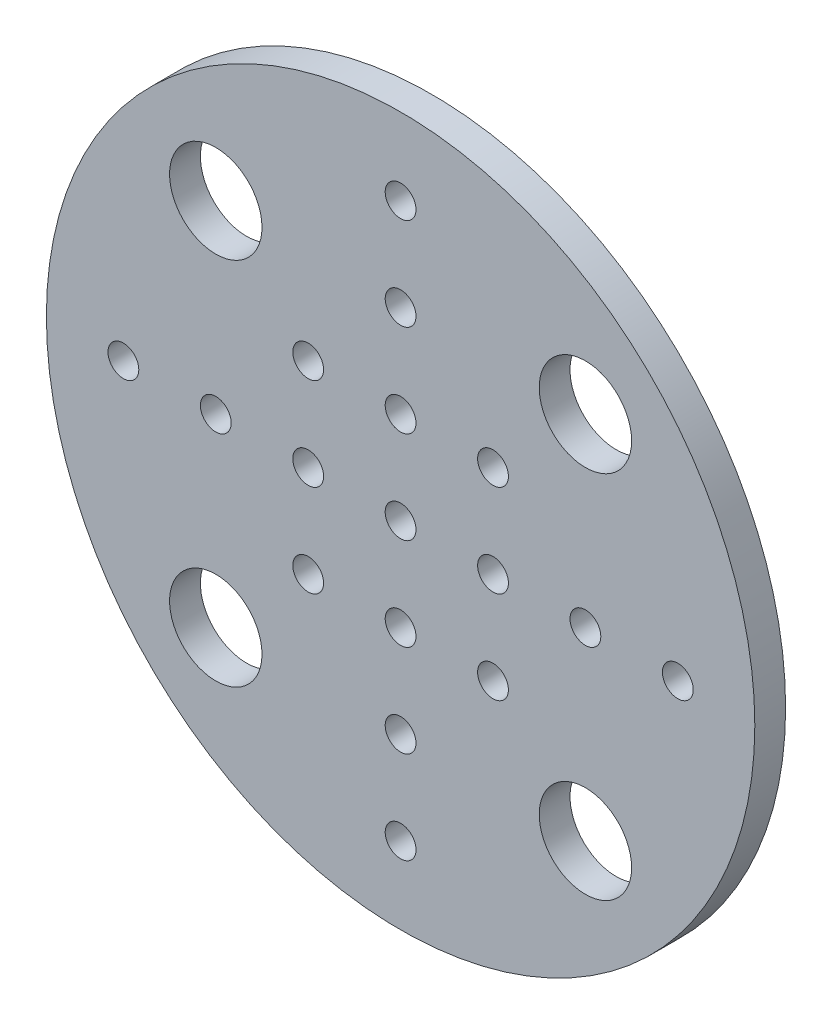
ISO-10303-21;
HEADER;
FILE_DESCRIPTION(('STEP AP214'),'2;1');
FILE_NAME('part.step','',(''),(''),'','','');
FILE_SCHEMA(('AUTOMOTIVE_DESIGN { 1 0 10303 214 1 1 1 1 }'));
ENDSEC;
DATA;
#1=APPLICATION_CONTEXT('core data for automotive mechanical design processes');
#2=APPLICATION_PROTOCOL_DEFINITION('international standard','automotive_design',2000,#1);
#3=PRODUCT_CONTEXT('',#1,'mechanical');
#4=PRODUCT('Part','Part','',(#3));
#5=PRODUCT_RELATED_PRODUCT_CATEGORY('part','',(#4));
#6=PRODUCT_DEFINITION_FORMATION('','',#4);
#7=PRODUCT_DEFINITION_CONTEXT('part definition',#1,'design');
#8=PRODUCT_DEFINITION('design','',#6,#7);
#9=PRODUCT_DEFINITION_SHAPE('','',#8);
#10=(LENGTH_UNIT() NAMED_UNIT(*) SI_UNIT(.MILLI.,.METRE.));
#11=(NAMED_UNIT(*) PLANE_ANGLE_UNIT() SI_UNIT($,.RADIAN.));
#12=(NAMED_UNIT(*) SI_UNIT($,.STERADIAN.) SOLID_ANGLE_UNIT());
#13=UNCERTAINTY_MEASURE_WITH_UNIT(LENGTH_MEASURE(1.E-05),#10,'distance_accuracy_value','');
#14=(GEOMETRIC_REPRESENTATION_CONTEXT(3) GLOBAL_UNCERTAINTY_ASSIGNED_CONTEXT((#13)) GLOBAL_UNIT_ASSIGNED_CONTEXT((#10,
#11,#12)) REPRESENTATION_CONTEXT('',''));
#15=CARTESIAN_POINT('',(0.,0.,0.));
#16=DIRECTION('',(0.,0.,1.));
#17=DIRECTION('',(1.,0.,0.));
#18=AXIS2_PLACEMENT_3D('',#15,#16,#17);
#19=CARTESIAN_POINT('',(299.5187540025,285.8788155958,3.));
#20=DIRECTION('',(0.,0.,1.));
#21=DIRECTION('',(1.,0.,0.));
#22=AXIS2_PLACEMENT_3D('',#19,#20,#21);
#23=PLANE('',#22);
#24=CARTESIAN_POINT('',(308.5187540025,276.8788155958,3.));
#25=DIRECTION('',(0.,0.,1.));
#26=DIRECTION('',(1.,0.,0.));
#27=AXIS2_PLACEMENT_3D('',#24,#25,#26);
#28=CIRCLE('',#27,1.5);
#29=CARTESIAN_POINT('',(310.0187540025,276.8788155958,3.));
#30=VERTEX_POINT('',#29);
#31=EDGE_CURVE('E155',#30,#30,#28,.T.);
#32=ORIENTED_EDGE('',*,*,#31,.F.);
#33=EDGE_LOOP('',(#32));
#34=FACE_BOUND('',#33,.T.);
#35=CARTESIAN_POINT('',(290.5187540025,276.8788155958,3.));
#36=DIRECTION('',(0.,0.,1.));
#37=DIRECTION('',(1.,0.,0.));
#38=AXIS2_PLACEMENT_3D('',#35,#36,#37);
#39=CIRCLE('',#38,1.5);
#40=CARTESIAN_POINT('',(292.0187540025,276.8788155958,3.));
#41=VERTEX_POINT('',#40);
#42=EDGE_CURVE('E143',#41,#41,#39,.T.);
#43=ORIENTED_EDGE('',*,*,#42,.F.);
#44=EDGE_LOOP('',(#43));
#45=FACE_BOUND('',#44,.T.);
#46=CARTESIAN_POINT('',(299.5187540025,267.8788155958,3.));
#47=DIRECTION('',(0.,0.,1.));
#48=DIRECTION('',(1.,0.,0.));
#49=AXIS2_PLACEMENT_3D('',#46,#47,#48);
#50=CIRCLE('',#49,1.5);
#51=CARTESIAN_POINT('',(301.0187540025,267.8788155958,3.));
#52=VERTEX_POINT('',#51);
#53=EDGE_CURVE('E131',#52,#52,#50,.T.);
#54=ORIENTED_EDGE('',*,*,#53,.F.);
#55=EDGE_LOOP('',(#54));
#56=FACE_BOUND('',#55,.T.);
#57=CARTESIAN_POINT('',(299.5187540025,303.8788155958,3.));
#58=DIRECTION('',(0.,0.,1.));
#59=DIRECTION('',(1.,0.,0.));
#60=AXIS2_PLACEMENT_3D('',#57,#58,#59);
#61=CIRCLE('',#60,1.5);
#62=CARTESIAN_POINT('',(301.0187540025,303.8788155958,3.));
#63=VERTEX_POINT('',#62);
#64=EDGE_CURVE('E119',#63,#63,#61,.T.);
#65=ORIENTED_EDGE('',*,*,#64,.F.);
#66=EDGE_LOOP('',(#65));
#67=FACE_BOUND('',#66,.T.);
#68=CARTESIAN_POINT('',(272.5187540025,285.8788155958,3.));
#69=DIRECTION('',(0.,0.,1.));
#70=DIRECTION('',(1.,0.,0.));
#71=AXIS2_PLACEMENT_3D('',#68,#69,#70);
#72=CIRCLE('',#71,1.5);
#73=CARTESIAN_POINT('',(274.0187540025,285.8788155958,3.));
#74=VERTEX_POINT('',#73);
#75=EDGE_CURVE('E107',#74,#74,#72,.T.);
#76=ORIENTED_EDGE('',*,*,#75,.F.);
#77=EDGE_LOOP('',(#76));
#78=FACE_BOUND('',#77,.T.);
#79=CARTESIAN_POINT('',(317.5187540025,285.8788155958,3.));
#80=DIRECTION('',(0.,0.,1.));
#81=DIRECTION('',(1.,0.,0.));
#82=AXIS2_PLACEMENT_3D('',#79,#80,#81);
#83=CIRCLE('',#82,1.5);
#84=CARTESIAN_POINT('',(319.0187540025,285.8788155958,3.));
#85=VERTEX_POINT('',#84);
#86=EDGE_CURVE('E95',#85,#85,#83,.T.);
#87=ORIENTED_EDGE('',*,*,#86,.F.);
#88=EDGE_LOOP('',(#87));
#89=FACE_BOUND('',#88,.T.);
#90=CARTESIAN_POINT('',(308.5187540025,285.8788155958,3.));
#91=DIRECTION('',(0.,0.,1.));
#92=DIRECTION('',(1.,0.,0.));
#93=AXIS2_PLACEMENT_3D('',#90,#91,#92);
#94=CIRCLE('',#93,1.5);
#95=CARTESIAN_POINT('',(310.0187540025,285.8788155958,3.));
#96=VERTEX_POINT('',#95);
#97=EDGE_CURVE('E83',#96,#96,#94,.T.);
#98=ORIENTED_EDGE('',*,*,#97,.F.);
#99=EDGE_LOOP('',(#98));
#100=FACE_BOUND('',#99,.T.);
#101=CARTESIAN_POINT('',(299.5187540025,276.8788155958,3.));
#102=DIRECTION('',(0.,0.,1.));
#103=DIRECTION('',(1.,0.,0.));
#104=AXIS2_PLACEMENT_3D('',#101,#102,#103);
#105=CIRCLE('',#104,1.5);
#106=CARTESIAN_POINT('',(301.0187540025,276.8788155958,3.));
#107=VERTEX_POINT('',#106);
#108=EDGE_CURVE('E71',#107,#107,#105,.T.);
#109=ORIENTED_EDGE('',*,*,#108,.F.);
#110=EDGE_LOOP('',(#109));
#111=FACE_BOUND('',#110,.T.);
#112=CARTESIAN_POINT('',(317.5187540025,303.8788155958,3.));
#113=DIRECTION('',(0.,0.,1.));
#114=DIRECTION('',(1.,0.,0.));
#115=AXIS2_PLACEMENT_3D('',#112,#113,#114);
#116=CIRCLE('',#115,4.5);
#117=CARTESIAN_POINT('',(322.0187540025,303.8788155958,3.));
#118=VERTEX_POINT('',#117);
#119=EDGE_CURVE('E59',#118,#118,#116,.T.);
#120=ORIENTED_EDGE('',*,*,#119,.F.);
#121=EDGE_LOOP('',(#120));
#122=FACE_BOUND('',#121,.T.);
#123=CARTESIAN_POINT('',(281.5187540025,267.8788155958,3.));
#124=DIRECTION('',(0.,0.,1.));
#125=DIRECTION('',(1.,0.,0.));
#126=AXIS2_PLACEMENT_3D('',#123,#124,#125);
#127=CIRCLE('',#126,4.5);
#128=CARTESIAN_POINT('',(286.0187540025,267.8788155958,3.));
#129=VERTEX_POINT('',#128);
#130=EDGE_CURVE('E47',#129,#129,#127,.T.);
#131=ORIENTED_EDGE('',*,*,#130,.F.);
#132=EDGE_LOOP('',(#131));
#133=FACE_BOUND('',#132,.T.);
#134=CARTESIAN_POINT('',(299.5187540025,285.8788155958,3.));
#135=DIRECTION('',(0.,0.,1.));
#136=DIRECTION('',(1.,0.,0.));
#137=AXIS2_PLACEMENT_3D('',#134,#135,#136);
#138=CIRCLE('',#137,34.5);
#139=CARTESIAN_POINT('',(334.0187540025,285.8788155958,3.));
#140=VERTEX_POINT('',#139);
#141=EDGE_CURVE('E10',#140,#140,#138,.T.);
#142=ORIENTED_EDGE('',*,*,#141,.T.);
#143=EDGE_LOOP('',(#142));
#144=FACE_BOUND('',#143,.T.);
#145=CARTESIAN_POINT('',(281.5187540025,303.8788155958,3.));
#146=DIRECTION('',(0.,0.,1.));
#147=DIRECTION('',(1.,0.,0.));
#148=AXIS2_PLACEMENT_3D('',#145,#146,#147);
#149=CIRCLE('',#148,4.5);
#150=CARTESIAN_POINT('',(286.0187540025,303.8788155958,3.));
#151=VERTEX_POINT('',#150);
#152=EDGE_CURVE('E42',#151,#151,#149,.T.);
#153=ORIENTED_EDGE('',*,*,#152,.F.);
#154=EDGE_LOOP('',(#153));
#155=FACE_BOUND('',#154,.T.);
#156=CARTESIAN_POINT('',(317.5187540025,267.8788155958,3.));
#157=DIRECTION('',(0.,0.,1.));
#158=DIRECTION('',(1.,0.,0.));
#159=AXIS2_PLACEMENT_3D('',#156,#157,#158);
#160=CIRCLE('',#159,4.5);
#161=CARTESIAN_POINT('',(322.0187540025,267.8788155958,3.));
#162=VERTEX_POINT('',#161);
#163=EDGE_CURVE('E53',#162,#162,#160,.T.);
#164=ORIENTED_EDGE('',*,*,#163,.F.);
#165=EDGE_LOOP('',(#164));
#166=FACE_BOUND('',#165,.T.);
#167=CARTESIAN_POINT('',(299.5187540025,285.8788155958,3.));
#168=DIRECTION('',(0.,0.,1.));
#169=DIRECTION('',(1.,0.,0.));
#170=AXIS2_PLACEMENT_3D('',#167,#168,#169);
#171=CIRCLE('',#170,1.5);
#172=CARTESIAN_POINT('',(301.0187540025,285.8788155958,3.));
#173=VERTEX_POINT('',#172);
#174=EDGE_CURVE('E65',#173,#173,#171,.T.);
#175=ORIENTED_EDGE('',*,*,#174,.F.);
#176=EDGE_LOOP('',(#175));
#177=FACE_BOUND('',#176,.T.);
#178=CARTESIAN_POINT('',(299.5187540025,294.8788155958,3.));
#179=DIRECTION('',(0.,0.,1.));
#180=DIRECTION('',(1.,0.,0.));
#181=AXIS2_PLACEMENT_3D('',#178,#179,#180);
#182=CIRCLE('',#181,1.5);
#183=CARTESIAN_POINT('',(301.0187540025,294.8788155958,3.));
#184=VERTEX_POINT('',#183);
#185=EDGE_CURVE('E77',#184,#184,#182,.T.);
#186=ORIENTED_EDGE('',*,*,#185,.F.);
#187=EDGE_LOOP('',(#186));
#188=FACE_BOUND('',#187,.T.);
#189=CARTESIAN_POINT('',(290.5187540025,285.8788155958,3.));
#190=DIRECTION('',(0.,0.,1.));
#191=DIRECTION('',(1.,0.,0.));
#192=AXIS2_PLACEMENT_3D('',#189,#190,#191);
#193=CIRCLE('',#192,1.5);
#194=CARTESIAN_POINT('',(292.0187540025,285.8788155958,3.));
#195=VERTEX_POINT('',#194);
#196=EDGE_CURVE('E89',#195,#195,#193,.T.);
#197=ORIENTED_EDGE('',*,*,#196,.F.);
#198=EDGE_LOOP('',(#197));
#199=FACE_BOUND('',#198,.T.);
#200=CARTESIAN_POINT('',(326.5187540025,285.8788155958,3.));
#201=DIRECTION('',(0.,0.,1.));
#202=DIRECTION('',(1.,0.,0.));
#203=AXIS2_PLACEMENT_3D('',#200,#201,#202);
#204=CIRCLE('',#203,1.5);
#205=CARTESIAN_POINT('',(328.0187540025,285.8788155958,3.));
#206=VERTEX_POINT('',#205);
#207=EDGE_CURVE('E101',#206,#206,#204,.T.);
#208=ORIENTED_EDGE('',*,*,#207,.F.);
#209=EDGE_LOOP('',(#208));
#210=FACE_BOUND('',#209,.T.);
#211=CARTESIAN_POINT('',(281.5187540025,285.8788155958,3.));
#212=DIRECTION('',(0.,0.,1.));
#213=DIRECTION('',(1.,0.,0.));
#214=AXIS2_PLACEMENT_3D('',#211,#212,#213);
#215=CIRCLE('',#214,1.5);
#216=CARTESIAN_POINT('',(283.0187540025,285.8788155958,3.));
#217=VERTEX_POINT('',#216);
#218=EDGE_CURVE('E113',#217,#217,#215,.T.);
#219=ORIENTED_EDGE('',*,*,#218,.F.);
#220=EDGE_LOOP('',(#219));
#221=FACE_BOUND('',#220,.T.);
#222=CARTESIAN_POINT('',(299.5187540025,312.8788155958,3.));
#223=DIRECTION('',(0.,0.,1.));
#224=DIRECTION('',(1.,0.,0.));
#225=AXIS2_PLACEMENT_3D('',#222,#223,#224);
#226=CIRCLE('',#225,1.5);
#227=CARTESIAN_POINT('',(301.0187540025,312.8788155958,3.));
#228=VERTEX_POINT('',#227);
#229=EDGE_CURVE('E125',#228,#228,#226,.T.);
#230=ORIENTED_EDGE('',*,*,#229,.F.);
#231=EDGE_LOOP('',(#230));
#232=FACE_BOUND('',#231,.T.);
#233=CARTESIAN_POINT('',(299.5187540025,258.8788155958,3.));
#234=DIRECTION('',(0.,0.,1.));
#235=DIRECTION('',(1.,0.,0.));
#236=AXIS2_PLACEMENT_3D('',#233,#234,#235);
#237=CIRCLE('',#236,1.5);
#238=CARTESIAN_POINT('',(301.0187540025,258.8788155958,3.));
#239=VERTEX_POINT('',#238);
#240=EDGE_CURVE('E137',#239,#239,#237,.T.);
#241=ORIENTED_EDGE('',*,*,#240,.F.);
#242=EDGE_LOOP('',(#241));
#243=FACE_BOUND('',#242,.T.);
#244=CARTESIAN_POINT('',(308.5187540025,294.8788155958,3.));
#245=DIRECTION('',(0.,0.,1.));
#246=DIRECTION('',(1.,0.,0.));
#247=AXIS2_PLACEMENT_3D('',#244,#245,#246);
#248=CIRCLE('',#247,1.5);
#249=CARTESIAN_POINT('',(310.0187540025,294.8788155958,3.));
#250=VERTEX_POINT('',#249);
#251=EDGE_CURVE('E149',#250,#250,#248,.T.);
#252=ORIENTED_EDGE('',*,*,#251,.F.);
#253=EDGE_LOOP('',(#252));
#254=FACE_BOUND('',#253,.T.);
#255=CARTESIAN_POINT('',(290.5187540025,294.8788155958,3.));
#256=DIRECTION('',(0.,0.,1.));
#257=DIRECTION('',(1.,0.,0.));
#258=AXIS2_PLACEMENT_3D('',#255,#256,#257);
#259=CIRCLE('',#258,1.5);
#260=CARTESIAN_POINT('',(292.0187540025,294.8788155958,3.));
#261=VERTEX_POINT('',#260);
#262=EDGE_CURVE('E161',#261,#261,#259,.T.);
#263=ORIENTED_EDGE('',*,*,#262,.F.);
#264=EDGE_LOOP('',(#263));
#265=FACE_BOUND('',#264,.T.);
#266=ADVANCED_FACE('F31',(#34,#45,#56,#67,#78,#89,#100,#111,#122,#133,#144,#155,#166,#177,#188,
#199,#210,#221,#232,#243,#254,#265),#23,.T.);
#267=CARTESIAN_POINT('',(299.5187540025,285.8788155958,0.));
#268=DIRECTION('',(0.,0.,1.));
#269=DIRECTION('',(1.,0.,0.));
#270=AXIS2_PLACEMENT_3D('',#267,#268,#269);
#271=PLANE('',#270);
#272=CARTESIAN_POINT('',(308.5187540025,276.8788155958,0.));
#273=DIRECTION('',(0.,0.,1.));
#274=DIRECTION('',(1.,0.,0.));
#275=AXIS2_PLACEMENT_3D('',#272,#273,#274);
#276=CIRCLE('',#275,1.5);
#277=CARTESIAN_POINT('',(310.0187540025,276.8788155958,0.));
#278=VERTEX_POINT('',#277);
#279=EDGE_CURVE('E158',#278,#278,#276,.T.);
#280=ORIENTED_EDGE('',*,*,#279,.T.);
#281=EDGE_LOOP('',(#280));
#282=FACE_BOUND('',#281,.T.);
#283=CARTESIAN_POINT('',(290.5187540025,276.8788155958,0.));
#284=DIRECTION('',(0.,0.,1.));
#285=DIRECTION('',(1.,0.,0.));
#286=AXIS2_PLACEMENT_3D('',#283,#284,#285);
#287=CIRCLE('',#286,1.5);
#288=CARTESIAN_POINT('',(292.0187540025,276.8788155958,0.));
#289=VERTEX_POINT('',#288);
#290=EDGE_CURVE('E146',#289,#289,#287,.T.);
#291=ORIENTED_EDGE('',*,*,#290,.T.);
#292=EDGE_LOOP('',(#291));
#293=FACE_BOUND('',#292,.T.);
#294=CARTESIAN_POINT('',(299.5187540025,267.8788155958,0.));
#295=DIRECTION('',(0.,0.,1.));
#296=DIRECTION('',(1.,0.,0.));
#297=AXIS2_PLACEMENT_3D('',#294,#295,#296);
#298=CIRCLE('',#297,1.5);
#299=CARTESIAN_POINT('',(301.0187540025,267.8788155958,0.));
#300=VERTEX_POINT('',#299);
#301=EDGE_CURVE('E134',#300,#300,#298,.T.);
#302=ORIENTED_EDGE('',*,*,#301,.T.);
#303=EDGE_LOOP('',(#302));
#304=FACE_BOUND('',#303,.T.);
#305=CARTESIAN_POINT('',(299.5187540025,303.8788155958,0.));
#306=DIRECTION('',(0.,0.,1.));
#307=DIRECTION('',(1.,0.,0.));
#308=AXIS2_PLACEMENT_3D('',#305,#306,#307);
#309=CIRCLE('',#308,1.5);
#310=CARTESIAN_POINT('',(301.0187540025,303.8788155958,0.));
#311=VERTEX_POINT('',#310);
#312=EDGE_CURVE('E122',#311,#311,#309,.T.);
#313=ORIENTED_EDGE('',*,*,#312,.T.);
#314=EDGE_LOOP('',(#313));
#315=FACE_BOUND('',#314,.T.);
#316=CARTESIAN_POINT('',(272.5187540025,285.8788155958,0.));
#317=DIRECTION('',(0.,0.,1.));
#318=DIRECTION('',(1.,0.,0.));
#319=AXIS2_PLACEMENT_3D('',#316,#317,#318);
#320=CIRCLE('',#319,1.5);
#321=CARTESIAN_POINT('',(274.0187540025,285.8788155958,0.));
#322=VERTEX_POINT('',#321);
#323=EDGE_CURVE('E110',#322,#322,#320,.T.);
#324=ORIENTED_EDGE('',*,*,#323,.T.);
#325=EDGE_LOOP('',(#324));
#326=FACE_BOUND('',#325,.T.);
#327=CARTESIAN_POINT('',(317.5187540025,285.8788155958,0.));
#328=DIRECTION('',(0.,0.,1.));
#329=DIRECTION('',(1.,0.,0.));
#330=AXIS2_PLACEMENT_3D('',#327,#328,#329);
#331=CIRCLE('',#330,1.5);
#332=CARTESIAN_POINT('',(319.0187540025,285.8788155958,0.));
#333=VERTEX_POINT('',#332);
#334=EDGE_CURVE('E98',#333,#333,#331,.T.);
#335=ORIENTED_EDGE('',*,*,#334,.T.);
#336=EDGE_LOOP('',(#335));
#337=FACE_BOUND('',#336,.T.);
#338=CARTESIAN_POINT('',(308.5187540025,285.8788155958,0.));
#339=DIRECTION('',(0.,0.,1.));
#340=DIRECTION('',(1.,0.,0.));
#341=AXIS2_PLACEMENT_3D('',#338,#339,#340);
#342=CIRCLE('',#341,1.5);
#343=CARTESIAN_POINT('',(310.0187540025,285.8788155958,0.));
#344=VERTEX_POINT('',#343);
#345=EDGE_CURVE('E86',#344,#344,#342,.T.);
#346=ORIENTED_EDGE('',*,*,#345,.T.);
#347=EDGE_LOOP('',(#346));
#348=FACE_BOUND('',#347,.T.);
#349=CARTESIAN_POINT('',(299.5187540025,276.8788155958,0.));
#350=DIRECTION('',(0.,0.,1.));
#351=DIRECTION('',(1.,0.,0.));
#352=AXIS2_PLACEMENT_3D('',#349,#350,#351);
#353=CIRCLE('',#352,1.5);
#354=CARTESIAN_POINT('',(301.0187540025,276.8788155958,0.));
#355=VERTEX_POINT('',#354);
#356=EDGE_CURVE('E74',#355,#355,#353,.T.);
#357=ORIENTED_EDGE('',*,*,#356,.T.);
#358=EDGE_LOOP('',(#357));
#359=FACE_BOUND('',#358,.T.);
#360=CARTESIAN_POINT('',(317.5187540025,303.8788155958,0.));
#361=DIRECTION('',(0.,0.,1.));
#362=DIRECTION('',(1.,0.,0.));
#363=AXIS2_PLACEMENT_3D('',#360,#361,#362);
#364=CIRCLE('',#363,4.5);
#365=CARTESIAN_POINT('',(322.0187540025,303.8788155958,0.));
#366=VERTEX_POINT('',#365);
#367=EDGE_CURVE('E62',#366,#366,#364,.T.);
#368=ORIENTED_EDGE('',*,*,#367,.T.);
#369=EDGE_LOOP('',(#368));
#370=FACE_BOUND('',#369,.T.);
#371=CARTESIAN_POINT('',(281.5187540025,267.8788155958,0.));
#372=DIRECTION('',(0.,0.,1.));
#373=DIRECTION('',(1.,0.,0.));
#374=AXIS2_PLACEMENT_3D('',#371,#372,#373);
#375=CIRCLE('',#374,4.5);
#376=CARTESIAN_POINT('',(286.0187540025,267.8788155958,0.));
#377=VERTEX_POINT('',#376);
#378=EDGE_CURVE('E50',#377,#377,#375,.T.);
#379=ORIENTED_EDGE('',*,*,#378,.T.);
#380=EDGE_LOOP('',(#379));
#381=FACE_BOUND('',#380,.T.);
#382=CARTESIAN_POINT('',(299.5187540025,285.8788155958,0.));
#383=DIRECTION('',(0.,0.,1.));
#384=DIRECTION('',(1.,0.,0.));
#385=AXIS2_PLACEMENT_3D('',#382,#383,#384);
#386=CIRCLE('',#385,34.5);
#387=CARTESIAN_POINT('',(334.0187540025,285.8788155958,0.));
#388=VERTEX_POINT('',#387);
#389=EDGE_CURVE('E35',#388,#388,#386,.T.);
#390=ORIENTED_EDGE('',*,*,#389,.F.);
#391=EDGE_LOOP('',(#390));
#392=FACE_BOUND('',#391,.T.);
#393=CARTESIAN_POINT('',(281.5187540025,303.8788155958,0.));
#394=DIRECTION('',(0.,0.,1.));
#395=DIRECTION('',(1.,0.,0.));
#396=AXIS2_PLACEMENT_3D('',#393,#394,#395);
#397=CIRCLE('',#396,4.5);
#398=CARTESIAN_POINT('',(286.0187540025,303.8788155958,0.));
#399=VERTEX_POINT('',#398);
#400=EDGE_CURVE('E44',#399,#399,#397,.T.);
#401=ORIENTED_EDGE('',*,*,#400,.T.);
#402=EDGE_LOOP('',(#401));
#403=FACE_BOUND('',#402,.T.);
#404=CARTESIAN_POINT('',(317.5187540025,267.8788155958,0.));
#405=DIRECTION('',(0.,0.,1.));
#406=DIRECTION('',(1.,0.,0.));
#407=AXIS2_PLACEMENT_3D('',#404,#405,#406);
#408=CIRCLE('',#407,4.5);
#409=CARTESIAN_POINT('',(322.0187540025,267.8788155958,0.));
#410=VERTEX_POINT('',#409);
#411=EDGE_CURVE('E56',#410,#410,#408,.T.);
#412=ORIENTED_EDGE('',*,*,#411,.T.);
#413=EDGE_LOOP('',(#412));
#414=FACE_BOUND('',#413,.T.);
#415=CARTESIAN_POINT('',(299.5187540025,285.8788155958,0.));
#416=DIRECTION('',(0.,0.,1.));
#417=DIRECTION('',(1.,0.,0.));
#418=AXIS2_PLACEMENT_3D('',#415,#416,#417);
#419=CIRCLE('',#418,1.5);
#420=CARTESIAN_POINT('',(301.0187540025,285.8788155958,0.));
#421=VERTEX_POINT('',#420);
#422=EDGE_CURVE('E68',#421,#421,#419,.T.);
#423=ORIENTED_EDGE('',*,*,#422,.T.);
#424=EDGE_LOOP('',(#423));
#425=FACE_BOUND('',#424,.T.);
#426=CARTESIAN_POINT('',(299.5187540025,294.8788155958,0.));
#427=DIRECTION('',(0.,0.,1.));
#428=DIRECTION('',(1.,0.,0.));
#429=AXIS2_PLACEMENT_3D('',#426,#427,#428);
#430=CIRCLE('',#429,1.5);
#431=CARTESIAN_POINT('',(301.0187540025,294.8788155958,0.));
#432=VERTEX_POINT('',#431);
#433=EDGE_CURVE('E80',#432,#432,#430,.T.);
#434=ORIENTED_EDGE('',*,*,#433,.T.);
#435=EDGE_LOOP('',(#434));
#436=FACE_BOUND('',#435,.T.);
#437=CARTESIAN_POINT('',(290.5187540025,285.8788155958,0.));
#438=DIRECTION('',(0.,0.,1.));
#439=DIRECTION('',(1.,0.,0.));
#440=AXIS2_PLACEMENT_3D('',#437,#438,#439);
#441=CIRCLE('',#440,1.5);
#442=CARTESIAN_POINT('',(292.0187540025,285.8788155958,0.));
#443=VERTEX_POINT('',#442);
#444=EDGE_CURVE('E92',#443,#443,#441,.T.);
#445=ORIENTED_EDGE('',*,*,#444,.T.);
#446=EDGE_LOOP('',(#445));
#447=FACE_BOUND('',#446,.T.);
#448=CARTESIAN_POINT('',(326.5187540025,285.8788155958,0.));
#449=DIRECTION('',(0.,0.,1.));
#450=DIRECTION('',(1.,0.,0.));
#451=AXIS2_PLACEMENT_3D('',#448,#449,#450);
#452=CIRCLE('',#451,1.5);
#453=CARTESIAN_POINT('',(328.0187540025,285.8788155958,0.));
#454=VERTEX_POINT('',#453);
#455=EDGE_CURVE('E104',#454,#454,#452,.T.);
#456=ORIENTED_EDGE('',*,*,#455,.T.);
#457=EDGE_LOOP('',(#456));
#458=FACE_BOUND('',#457,.T.);
#459=CARTESIAN_POINT('',(281.5187540025,285.8788155958,0.));
#460=DIRECTION('',(0.,0.,1.));
#461=DIRECTION('',(1.,0.,0.));
#462=AXIS2_PLACEMENT_3D('',#459,#460,#461);
#463=CIRCLE('',#462,1.5);
#464=CARTESIAN_POINT('',(283.0187540025,285.8788155958,0.));
#465=VERTEX_POINT('',#464);
#466=EDGE_CURVE('E116',#465,#465,#463,.T.);
#467=ORIENTED_EDGE('',*,*,#466,.T.);
#468=EDGE_LOOP('',(#467));
#469=FACE_BOUND('',#468,.T.);
#470=CARTESIAN_POINT('',(299.5187540025,312.8788155958,0.));
#471=DIRECTION('',(0.,0.,1.));
#472=DIRECTION('',(1.,0.,0.));
#473=AXIS2_PLACEMENT_3D('',#470,#471,#472);
#474=CIRCLE('',#473,1.5);
#475=CARTESIAN_POINT('',(301.0187540025,312.8788155958,0.));
#476=VERTEX_POINT('',#475);
#477=EDGE_CURVE('E128',#476,#476,#474,.T.);
#478=ORIENTED_EDGE('',*,*,#477,.T.);
#479=EDGE_LOOP('',(#478));
#480=FACE_BOUND('',#479,.T.);
#481=CARTESIAN_POINT('',(299.5187540025,258.8788155958,0.));
#482=DIRECTION('',(0.,0.,1.));
#483=DIRECTION('',(1.,0.,0.));
#484=AXIS2_PLACEMENT_3D('',#481,#482,#483);
#485=CIRCLE('',#484,1.5);
#486=CARTESIAN_POINT('',(301.0187540025,258.8788155958,0.));
#487=VERTEX_POINT('',#486);
#488=EDGE_CURVE('E140',#487,#487,#485,.T.);
#489=ORIENTED_EDGE('',*,*,#488,.T.);
#490=EDGE_LOOP('',(#489));
#491=FACE_BOUND('',#490,.T.);
#492=CARTESIAN_POINT('',(308.5187540025,294.8788155958,0.));
#493=DIRECTION('',(0.,0.,1.));
#494=DIRECTION('',(1.,0.,0.));
#495=AXIS2_PLACEMENT_3D('',#492,#493,#494);
#496=CIRCLE('',#495,1.5);
#497=CARTESIAN_POINT('',(310.0187540025,294.8788155958,0.));
#498=VERTEX_POINT('',#497);
#499=EDGE_CURVE('E152',#498,#498,#496,.T.);
#500=ORIENTED_EDGE('',*,*,#499,.T.);
#501=EDGE_LOOP('',(#500));
#502=FACE_BOUND('',#501,.T.);
#503=CARTESIAN_POINT('',(290.5187540025,294.8788155958,0.));
#504=DIRECTION('',(0.,0.,1.));
#505=DIRECTION('',(1.,0.,0.));
#506=AXIS2_PLACEMENT_3D('',#503,#504,#505);
#507=CIRCLE('',#506,1.5);
#508=CARTESIAN_POINT('',(292.0187540025,294.8788155958,0.));
#509=VERTEX_POINT('',#508);
#510=EDGE_CURVE('E164',#509,#509,#507,.T.);
#511=ORIENTED_EDGE('',*,*,#510,.T.);
#512=EDGE_LOOP('',(#511));
#513=FACE_BOUND('',#512,.T.);
#514=ADVANCED_FACE('F174',(#282,#293,#304,#315,#326,#337,#348,#359,#370,#381,#392,#403,#414,
#425,#436,#447,#458,#469,#480,#491,#502,#513),#271,.F.);
#515=CARTESIAN_POINT('',(299.5187540025,285.8788155958,3.));
#516=DIRECTION('',(0.,0.,-1.));
#517=DIRECTION('',(-1.,0.,0.));
#518=AXIS2_PLACEMENT_3D('',#515,#516,#517);
#519=CYLINDRICAL_SURFACE('',#518,34.5);
#520=ORIENTED_EDGE('',*,*,#141,.F.);
#521=EDGE_LOOP('',(#520));
#522=FACE_BOUND('',#521,.T.);
#523=ORIENTED_EDGE('',*,*,#389,.T.);
#524=EDGE_LOOP('',(#523));
#525=FACE_BOUND('',#524,.T.);
#526=ADVANCED_FACE('F33',(#522,#525),#519,.T.);
#527=CARTESIAN_POINT('',(281.5187540025,303.8788155958,3.));
#528=DIRECTION('',(0.,0.,-1.));
#529=DIRECTION('',(-1.,0.,0.));
#530=AXIS2_PLACEMENT_3D('',#527,#528,#529);
#531=CYLINDRICAL_SURFACE('',#530,4.5);
#532=ORIENTED_EDGE('',*,*,#152,.T.);
#533=EDGE_LOOP('',(#532));
#534=FACE_BOUND('',#533,.T.);
#535=ORIENTED_EDGE('',*,*,#400,.F.);
#536=EDGE_LOOP('',(#535));
#537=FACE_BOUND('',#536,.T.);
#538=ADVANCED_FACE('F184',(#534,#537),#531,.F.);
#539=CARTESIAN_POINT('',(281.5187540025,267.8788155958,3.));
#540=DIRECTION('',(0.,0.,-1.));
#541=DIRECTION('',(-1.,0.,0.));
#542=AXIS2_PLACEMENT_3D('',#539,#540,#541);
#543=CYLINDRICAL_SURFACE('',#542,4.5);
#544=ORIENTED_EDGE('',*,*,#130,.T.);
#545=EDGE_LOOP('',(#544));
#546=FACE_BOUND('',#545,.T.);
#547=ORIENTED_EDGE('',*,*,#378,.F.);
#548=EDGE_LOOP('',(#547));
#549=FACE_BOUND('',#548,.T.);
#550=ADVANCED_FACE('F187',(#546,#549),#543,.F.);
#551=CARTESIAN_POINT('',(317.5187540025,267.8788155958,3.));
#552=DIRECTION('',(0.,0.,-1.));
#553=DIRECTION('',(-1.,0.,0.));
#554=AXIS2_PLACEMENT_3D('',#551,#552,#553);
#555=CYLINDRICAL_SURFACE('',#554,4.5);
#556=ORIENTED_EDGE('',*,*,#163,.T.);
#557=EDGE_LOOP('',(#556));
#558=FACE_BOUND('',#557,.T.);
#559=ORIENTED_EDGE('',*,*,#411,.F.);
#560=EDGE_LOOP('',(#559));
#561=FACE_BOUND('',#560,.T.);
#562=ADVANCED_FACE('F191',(#558,#561),#555,.F.);
#563=CARTESIAN_POINT('',(317.5187540025,303.8788155958,3.));
#564=DIRECTION('',(0.,0.,-1.));
#565=DIRECTION('',(-1.,0.,0.));
#566=AXIS2_PLACEMENT_3D('',#563,#564,#565);
#567=CYLINDRICAL_SURFACE('',#566,4.5);
#568=ORIENTED_EDGE('',*,*,#119,.T.);
#569=EDGE_LOOP('',(#568));
#570=FACE_BOUND('',#569,.T.);
#571=ORIENTED_EDGE('',*,*,#367,.F.);
#572=EDGE_LOOP('',(#571));
#573=FACE_BOUND('',#572,.T.);
#574=ADVANCED_FACE('F195',(#570,#573),#567,.F.);
#575=CARTESIAN_POINT('',(299.5187540025,285.8788155958,3.));
#576=DIRECTION('',(0.,0.,-1.));
#577=DIRECTION('',(-1.,0.,0.));
#578=AXIS2_PLACEMENT_3D('',#575,#576,#577);
#579=CYLINDRICAL_SURFACE('',#578,1.5);
#580=ORIENTED_EDGE('',*,*,#174,.T.);
#581=EDGE_LOOP('',(#580));
#582=FACE_BOUND('',#581,.T.);
#583=ORIENTED_EDGE('',*,*,#422,.F.);
#584=EDGE_LOOP('',(#583));
#585=FACE_BOUND('',#584,.T.);
#586=ADVANCED_FACE('F199',(#582,#585),#579,.F.);
#587=CARTESIAN_POINT('',(299.5187540025,276.8788155958,3.));
#588=DIRECTION('',(0.,0.,-1.));
#589=DIRECTION('',(-1.,0.,0.));
#590=AXIS2_PLACEMENT_3D('',#587,#588,#589);
#591=CYLINDRICAL_SURFACE('',#590,1.5);
#592=ORIENTED_EDGE('',*,*,#108,.T.);
#593=EDGE_LOOP('',(#592));
#594=FACE_BOUND('',#593,.T.);
#595=ORIENTED_EDGE('',*,*,#356,.F.);
#596=EDGE_LOOP('',(#595));
#597=FACE_BOUND('',#596,.T.);
#598=ADVANCED_FACE('F203',(#594,#597),#591,.F.);
#599=CARTESIAN_POINT('',(299.5187540025,294.8788155958,3.));
#600=DIRECTION('',(0.,0.,-1.));
#601=DIRECTION('',(-1.,0.,0.));
#602=AXIS2_PLACEMENT_3D('',#599,#600,#601);
#603=CYLINDRICAL_SURFACE('',#602,1.5);
#604=ORIENTED_EDGE('',*,*,#185,.T.);
#605=EDGE_LOOP('',(#604));
#606=FACE_BOUND('',#605,.T.);
#607=ORIENTED_EDGE('',*,*,#433,.F.);
#608=EDGE_LOOP('',(#607));
#609=FACE_BOUND('',#608,.T.);
#610=ADVANCED_FACE('F207',(#606,#609),#603,.F.);
#611=CARTESIAN_POINT('',(308.5187540025,285.8788155958,3.));
#612=DIRECTION('',(0.,0.,-1.));
#613=DIRECTION('',(-1.,0.,0.));
#614=AXIS2_PLACEMENT_3D('',#611,#612,#613);
#615=CYLINDRICAL_SURFACE('',#614,1.5);
#616=ORIENTED_EDGE('',*,*,#97,.T.);
#617=EDGE_LOOP('',(#616));
#618=FACE_BOUND('',#617,.T.);
#619=ORIENTED_EDGE('',*,*,#345,.F.);
#620=EDGE_LOOP('',(#619));
#621=FACE_BOUND('',#620,.T.);
#622=ADVANCED_FACE('F211',(#618,#621),#615,.F.);
#623=CARTESIAN_POINT('',(290.5187540025,285.8788155958,3.));
#624=DIRECTION('',(0.,0.,-1.));
#625=DIRECTION('',(-1.,0.,0.));
#626=AXIS2_PLACEMENT_3D('',#623,#624,#625);
#627=CYLINDRICAL_SURFACE('',#626,1.5);
#628=ORIENTED_EDGE('',*,*,#196,.T.);
#629=EDGE_LOOP('',(#628));
#630=FACE_BOUND('',#629,.T.);
#631=ORIENTED_EDGE('',*,*,#444,.F.);
#632=EDGE_LOOP('',(#631));
#633=FACE_BOUND('',#632,.T.);
#634=ADVANCED_FACE('F215',(#630,#633),#627,.F.);
#635=CARTESIAN_POINT('',(317.5187540025,285.8788155958,3.));
#636=DIRECTION('',(0.,0.,-1.));
#637=DIRECTION('',(-1.,0.,0.));
#638=AXIS2_PLACEMENT_3D('',#635,#636,#637);
#639=CYLINDRICAL_SURFACE('',#638,1.5);
#640=ORIENTED_EDGE('',*,*,#86,.T.);
#641=EDGE_LOOP('',(#640));
#642=FACE_BOUND('',#641,.T.);
#643=ORIENTED_EDGE('',*,*,#334,.F.);
#644=EDGE_LOOP('',(#643));
#645=FACE_BOUND('',#644,.T.);
#646=ADVANCED_FACE('F219',(#642,#645),#639,.F.);
#647=CARTESIAN_POINT('',(326.5187540025,285.8788155958,3.));
#648=DIRECTION('',(0.,0.,-1.));
#649=DIRECTION('',(-1.,0.,0.));
#650=AXIS2_PLACEMENT_3D('',#647,#648,#649);
#651=CYLINDRICAL_SURFACE('',#650,1.5);
#652=ORIENTED_EDGE('',*,*,#207,.T.);
#653=EDGE_LOOP('',(#652));
#654=FACE_BOUND('',#653,.T.);
#655=ORIENTED_EDGE('',*,*,#455,.F.);
#656=EDGE_LOOP('',(#655));
#657=FACE_BOUND('',#656,.T.);
#658=ADVANCED_FACE('F223',(#654,#657),#651,.F.);
#659=CARTESIAN_POINT('',(272.5187540025,285.8788155958,3.));
#660=DIRECTION('',(0.,0.,-1.));
#661=DIRECTION('',(-1.,0.,0.));
#662=AXIS2_PLACEMENT_3D('',#659,#660,#661);
#663=CYLINDRICAL_SURFACE('',#662,1.5);
#664=ORIENTED_EDGE('',*,*,#75,.T.);
#665=EDGE_LOOP('',(#664));
#666=FACE_BOUND('',#665,.T.);
#667=ORIENTED_EDGE('',*,*,#323,.F.);
#668=EDGE_LOOP('',(#667));
#669=FACE_BOUND('',#668,.T.);
#670=ADVANCED_FACE('F227',(#666,#669),#663,.F.);
#671=CARTESIAN_POINT('',(281.5187540025,285.8788155958,3.));
#672=DIRECTION('',(0.,0.,-1.));
#673=DIRECTION('',(-1.,0.,0.));
#674=AXIS2_PLACEMENT_3D('',#671,#672,#673);
#675=CYLINDRICAL_SURFACE('',#674,1.5);
#676=ORIENTED_EDGE('',*,*,#218,.T.);
#677=EDGE_LOOP('',(#676));
#678=FACE_BOUND('',#677,.T.);
#679=ORIENTED_EDGE('',*,*,#466,.F.);
#680=EDGE_LOOP('',(#679));
#681=FACE_BOUND('',#680,.T.);
#682=ADVANCED_FACE('F231',(#678,#681),#675,.F.);
#683=CARTESIAN_POINT('',(299.5187540025,303.8788155958,3.));
#684=DIRECTION('',(0.,0.,-1.));
#685=DIRECTION('',(-1.,0.,0.));
#686=AXIS2_PLACEMENT_3D('',#683,#684,#685);
#687=CYLINDRICAL_SURFACE('',#686,1.5);
#688=ORIENTED_EDGE('',*,*,#64,.T.);
#689=EDGE_LOOP('',(#688));
#690=FACE_BOUND('',#689,.T.);
#691=ORIENTED_EDGE('',*,*,#312,.F.);
#692=EDGE_LOOP('',(#691));
#693=FACE_BOUND('',#692,.T.);
#694=ADVANCED_FACE('F235',(#690,#693),#687,.F.);
#695=CARTESIAN_POINT('',(299.5187540025,312.8788155958,3.));
#696=DIRECTION('',(0.,0.,-1.));
#697=DIRECTION('',(-1.,0.,0.));
#698=AXIS2_PLACEMENT_3D('',#695,#696,#697);
#699=CYLINDRICAL_SURFACE('',#698,1.5);
#700=ORIENTED_EDGE('',*,*,#229,.T.);
#701=EDGE_LOOP('',(#700));
#702=FACE_BOUND('',#701,.T.);
#703=ORIENTED_EDGE('',*,*,#477,.F.);
#704=EDGE_LOOP('',(#703));
#705=FACE_BOUND('',#704,.T.);
#706=ADVANCED_FACE('F239',(#702,#705),#699,.F.);
#707=CARTESIAN_POINT('',(299.5187540025,267.8788155958,3.));
#708=DIRECTION('',(0.,0.,-1.));
#709=DIRECTION('',(-1.,0.,0.));
#710=AXIS2_PLACEMENT_3D('',#707,#708,#709);
#711=CYLINDRICAL_SURFACE('',#710,1.5);
#712=ORIENTED_EDGE('',*,*,#53,.T.);
#713=EDGE_LOOP('',(#712));
#714=FACE_BOUND('',#713,.T.);
#715=ORIENTED_EDGE('',*,*,#301,.F.);
#716=EDGE_LOOP('',(#715));
#717=FACE_BOUND('',#716,.T.);
#718=ADVANCED_FACE('F243',(#714,#717),#711,.F.);
#719=CARTESIAN_POINT('',(299.5187540025,258.8788155958,3.));
#720=DIRECTION('',(0.,0.,-1.));
#721=DIRECTION('',(-1.,0.,0.));
#722=AXIS2_PLACEMENT_3D('',#719,#720,#721);
#723=CYLINDRICAL_SURFACE('',#722,1.5);
#724=ORIENTED_EDGE('',*,*,#240,.T.);
#725=EDGE_LOOP('',(#724));
#726=FACE_BOUND('',#725,.T.);
#727=ORIENTED_EDGE('',*,*,#488,.F.);
#728=EDGE_LOOP('',(#727));
#729=FACE_BOUND('',#728,.T.);
#730=ADVANCED_FACE('F247',(#726,#729),#723,.F.);
#731=CARTESIAN_POINT('',(290.5187540025,276.8788155958,3.));
#732=DIRECTION('',(0.,0.,-1.));
#733=DIRECTION('',(-1.,0.,0.));
#734=AXIS2_PLACEMENT_3D('',#731,#732,#733);
#735=CYLINDRICAL_SURFACE('',#734,1.5);
#736=ORIENTED_EDGE('',*,*,#42,.T.);
#737=EDGE_LOOP('',(#736));
#738=FACE_BOUND('',#737,.T.);
#739=ORIENTED_EDGE('',*,*,#290,.F.);
#740=EDGE_LOOP('',(#739));
#741=FACE_BOUND('',#740,.T.);
#742=ADVANCED_FACE('F251',(#738,#741),#735,.F.);
#743=CARTESIAN_POINT('',(308.5187540025,294.8788155958,3.));
#744=DIRECTION('',(0.,0.,-1.));
#745=DIRECTION('',(-1.,0.,0.));
#746=AXIS2_PLACEMENT_3D('',#743,#744,#745);
#747=CYLINDRICAL_SURFACE('',#746,1.5);
#748=ORIENTED_EDGE('',*,*,#251,.T.);
#749=EDGE_LOOP('',(#748));
#750=FACE_BOUND('',#749,.T.);
#751=ORIENTED_EDGE('',*,*,#499,.F.);
#752=EDGE_LOOP('',(#751));
#753=FACE_BOUND('',#752,.T.);
#754=ADVANCED_FACE('F255',(#750,#753),#747,.F.);
#755=CARTESIAN_POINT('',(308.5187540025,276.8788155958,3.));
#756=DIRECTION('',(0.,0.,-1.));
#757=DIRECTION('',(-1.,0.,0.));
#758=AXIS2_PLACEMENT_3D('',#755,#756,#757);
#759=CYLINDRICAL_SURFACE('',#758,1.5);
#760=ORIENTED_EDGE('',*,*,#31,.T.);
#761=EDGE_LOOP('',(#760));
#762=FACE_BOUND('',#761,.T.);
#763=ORIENTED_EDGE('',*,*,#279,.F.);
#764=EDGE_LOOP('',(#763));
#765=FACE_BOUND('',#764,.T.);
#766=ADVANCED_FACE('F259',(#762,#765),#759,.F.);
#767=CARTESIAN_POINT('',(290.5187540025,294.8788155958,3.));
#768=DIRECTION('',(0.,0.,-1.));
#769=DIRECTION('',(-1.,0.,0.));
#770=AXIS2_PLACEMENT_3D('',#767,#768,#769);
#771=CYLINDRICAL_SURFACE('',#770,1.5);
#772=ORIENTED_EDGE('',*,*,#262,.T.);
#773=EDGE_LOOP('',(#772));
#774=FACE_BOUND('',#773,.T.);
#775=ORIENTED_EDGE('',*,*,#510,.F.);
#776=EDGE_LOOP('',(#775));
#777=FACE_BOUND('',#776,.T.);
#778=ADVANCED_FACE('F170',(#774,#777),#771,.F.);
#779=CLOSED_SHELL('',(#266,#514,#526,#538,#550,#562,#574,#586,#598,#610,#622,#634,#646,#658,
#670,#682,#694,#706,#718,#730,#742,#754,#766,#778));
#780=MANIFOLD_SOLID_BREP('B2',#779);
#781=ADVANCED_BREP_SHAPE_REPRESENTATION('',(#18,#780),#14);
#782=SHAPE_DEFINITION_REPRESENTATION(#9,#781);
ENDSEC;
END-ISO-10303-21;
